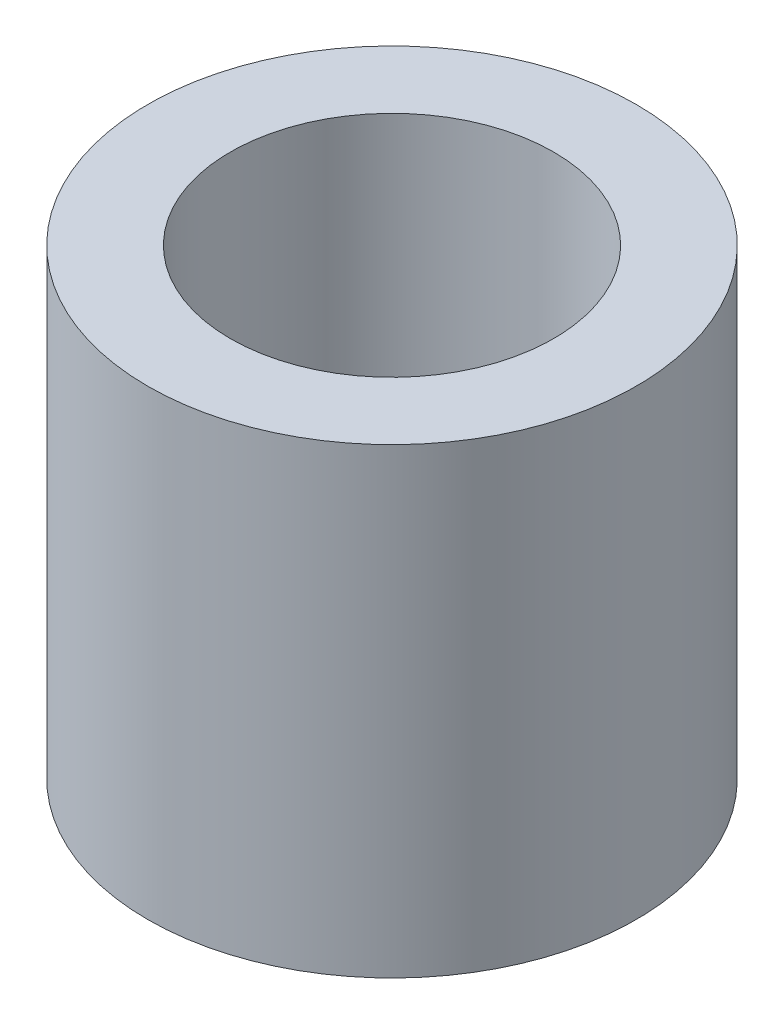
ISO-10303-21;
HEADER;
FILE_DESCRIPTION(('STEP AP214'),'2;1');
FILE_NAME('part.step','',(''),(''),'','','');
FILE_SCHEMA(('AUTOMOTIVE_DESIGN { 1 0 10303 214 1 1 1 1 }'));
ENDSEC;
DATA;
#1=APPLICATION_CONTEXT('core data for automotive mechanical design processes');
#2=APPLICATION_PROTOCOL_DEFINITION('international standard','automotive_design',2000,#1);
#3=PRODUCT_CONTEXT('',#1,'mechanical');
#4=PRODUCT('Part','Part','',(#3));
#5=PRODUCT_RELATED_PRODUCT_CATEGORY('part','',(#4));
#6=PRODUCT_DEFINITION_FORMATION('','',#4);
#7=PRODUCT_DEFINITION_CONTEXT('part definition',#1,'design');
#8=PRODUCT_DEFINITION('design','',#6,#7);
#9=PRODUCT_DEFINITION_SHAPE('','',#8);
#10=(LENGTH_UNIT() NAMED_UNIT(*) SI_UNIT(.MILLI.,.METRE.));
#11=(NAMED_UNIT(*) PLANE_ANGLE_UNIT() SI_UNIT($,.RADIAN.));
#12=(NAMED_UNIT(*) SI_UNIT($,.STERADIAN.) SOLID_ANGLE_UNIT());
#13=UNCERTAINTY_MEASURE_WITH_UNIT(LENGTH_MEASURE(1.E-05),#10,'distance_accuracy_value','');
#14=(GEOMETRIC_REPRESENTATION_CONTEXT(3) GLOBAL_UNCERTAINTY_ASSIGNED_CONTEXT((#13)) GLOBAL_UNIT_ASSIGNED_CONTEXT((#10,
#11,#12)) REPRESENTATION_CONTEXT('',''));
#15=CARTESIAN_POINT('',(0.,0.,0.));
#16=DIRECTION('',(0.,0.,1.));
#17=DIRECTION('',(1.,0.,0.));
#18=AXIS2_PLACEMENT_3D('',#15,#16,#17);
#19=CARTESIAN_POINT('',(0.,14.,0.));
#20=DIRECTION('',(0.,-1.,0.));
#21=DIRECTION('',(0.,0.,-1.));
#22=AXIS2_PLACEMENT_3D('',#19,#20,#21);
#23=CYLINDRICAL_SURFACE('',#22,7.4);
#24=CARTESIAN_POINT('',(0.,14.,0.));
#25=DIRECTION('',(0.,1.,0.));
#26=DIRECTION('',(0.,0.,1.));
#27=AXIS2_PLACEMENT_3D('',#24,#25,#26);
#28=CIRCLE('',#27,7.4);
#29=CARTESIAN_POINT('',(0.,14.,7.4));
#30=VERTEX_POINT('',#29);
#31=EDGE_CURVE('E10',#30,#30,#28,.T.);
#32=ORIENTED_EDGE('',*,*,#31,.F.);
#33=EDGE_LOOP('',(#32));
#34=FACE_BOUND('',#33,.T.);
#35=CARTESIAN_POINT('',(0.,0.,0.));
#36=DIRECTION('',(0.,1.,0.));
#37=DIRECTION('',(0.,0.,1.));
#38=AXIS2_PLACEMENT_3D('',#35,#36,#37);
#39=CIRCLE('',#38,7.4);
#40=CARTESIAN_POINT('',(0.,0.,7.4));
#41=VERTEX_POINT('',#40);
#42=EDGE_CURVE('E40',#41,#41,#39,.T.);
#43=ORIENTED_EDGE('',*,*,#42,.T.);
#44=EDGE_LOOP('',(#43));
#45=FACE_BOUND('',#44,.T.);
#46=ADVANCED_FACE('F37',(#34,#45),#23,.T.);
#47=CARTESIAN_POINT('',(0.,14.,0.));
#48=DIRECTION('',(0.,1.,0.));
#49=DIRECTION('',(0.,0.,1.));
#50=AXIS2_PLACEMENT_3D('',#47,#48,#49);
#51=PLANE('',#50);
#52=CARTESIAN_POINT('',(0.,14.,0.));
#53=DIRECTION('',(0.,1.,0.));
#54=DIRECTION('',(0.,0.,1.));
#55=AXIS2_PLACEMENT_3D('',#52,#53,#54);
#56=CIRCLE('',#55,4.9);
#57=CARTESIAN_POINT('',(0.,14.,4.9));
#58=VERTEX_POINT('',#57);
#59=EDGE_CURVE('E49',#58,#58,#56,.T.);
#60=ORIENTED_EDGE('',*,*,#59,.F.);
#61=EDGE_LOOP('',(#60));
#62=FACE_BOUND('',#61,.T.);
#63=ORIENTED_EDGE('',*,*,#31,.T.);
#64=EDGE_LOOP('',(#63));
#65=FACE_BOUND('',#64,.T.);
#66=ADVANCED_FACE('F64',(#62,#65),#51,.T.);
#67=CARTESIAN_POINT('',(0.,0.,0.));
#68=DIRECTION('',(0.,1.,0.));
#69=DIRECTION('',(0.,0.,1.));
#70=AXIS2_PLACEMENT_3D('',#67,#68,#69);
#71=PLANE('',#70);
#72=CARTESIAN_POINT('',(0.,0.,0.));
#73=DIRECTION('',(0.,1.,0.));
#74=DIRECTION('',(0.,0.,1.));
#75=AXIS2_PLACEMENT_3D('',#72,#73,#74);
#76=CIRCLE('',#75,4.9);
#77=CARTESIAN_POINT('',(0.,0.,4.9));
#78=VERTEX_POINT('',#77);
#79=EDGE_CURVE('E47',#78,#78,#76,.T.);
#80=ORIENTED_EDGE('',*,*,#79,.T.);
#81=EDGE_LOOP('',(#80));
#82=FACE_BOUND('',#81,.T.);
#83=ORIENTED_EDGE('',*,*,#42,.F.);
#84=EDGE_LOOP('',(#83));
#85=FACE_BOUND('',#84,.T.);
#86=ADVANCED_FACE('F55',(#82,#85),#71,.F.);
#87=CARTESIAN_POINT('',(0.,0.,0.));
#88=DIRECTION('',(0.,1.,0.));
#89=DIRECTION('',(0.,0.,1.));
#90=AXIS2_PLACEMENT_3D('',#87,#88,#89);
#91=CYLINDRICAL_SURFACE('',#90,4.9);
#92=ORIENTED_EDGE('',*,*,#79,.F.);
#93=EDGE_LOOP('',(#92));
#94=FACE_BOUND('',#93,.T.);
#95=ORIENTED_EDGE('',*,*,#59,.T.);
#96=EDGE_LOOP('',(#95));
#97=FACE_BOUND('',#96,.T.);
#98=ADVANCED_FACE('F58',(#94,#97),#91,.F.);
#99=CLOSED_SHELL('',(#46,#66,#86,#98));
#100=MANIFOLD_SOLID_BREP('B2',#99);
#101=ADVANCED_BREP_SHAPE_REPRESENTATION('',(#18,#100),#14);
#102=SHAPE_DEFINITION_REPRESENTATION(#9,#101);
ENDSEC;
END-ISO-10303-21;
